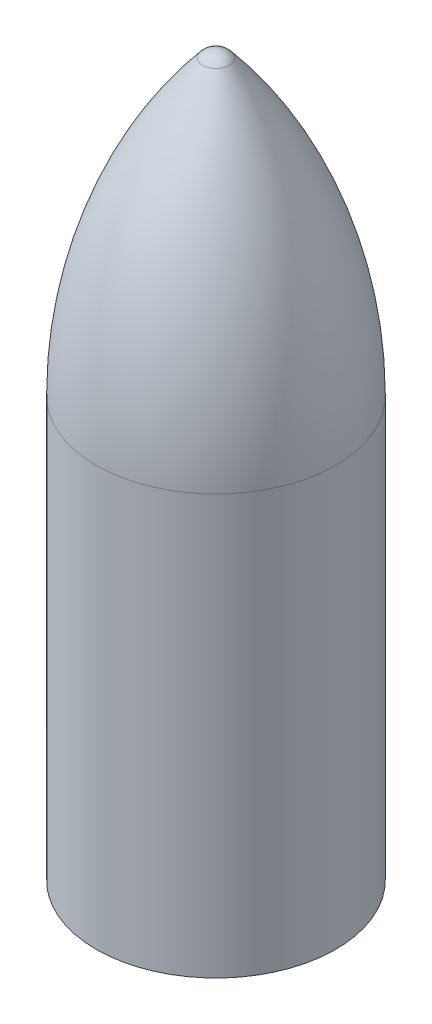
ISO-10303-21;
HEADER;
FILE_DESCRIPTION(('STEP AP214'),'2;1');
FILE_NAME('part.step','',(''),(''),'','','');
FILE_SCHEMA(('AUTOMOTIVE_DESIGN { 1 0 10303 214 1 1 1 1 }'));
ENDSEC;
DATA;
#1=APPLICATION_CONTEXT('core data for automotive mechanical design processes');
#2=APPLICATION_PROTOCOL_DEFINITION('international standard','automotive_design',2000,#1);
#3=PRODUCT_CONTEXT('',#1,'mechanical');
#4=PRODUCT('Part','Part','',(#3));
#5=PRODUCT_RELATED_PRODUCT_CATEGORY('part','',(#4));
#6=PRODUCT_DEFINITION_FORMATION('','',#4);
#7=PRODUCT_DEFINITION_CONTEXT('part definition',#1,'design');
#8=PRODUCT_DEFINITION('design','',#6,#7);
#9=PRODUCT_DEFINITION_SHAPE('','',#8);
#10=(LENGTH_UNIT() NAMED_UNIT(*) SI_UNIT(.MILLI.,.METRE.));
#11=(NAMED_UNIT(*) PLANE_ANGLE_UNIT() SI_UNIT($,.RADIAN.));
#12=(NAMED_UNIT(*) SI_UNIT($,.STERADIAN.) SOLID_ANGLE_UNIT());
#13=UNCERTAINTY_MEASURE_WITH_UNIT(LENGTH_MEASURE(1.E-05),#10,'distance_accuracy_value','');
#14=(GEOMETRIC_REPRESENTATION_CONTEXT(3) GLOBAL_UNCERTAINTY_ASSIGNED_CONTEXT((#13)) GLOBAL_UNIT_ASSIGNED_CONTEXT((#10,
#11,#12)) REPRESENTATION_CONTEXT('',''));
#15=CARTESIAN_POINT('',(0.,0.,0.));
#16=DIRECTION('',(0.,0.,1.));
#17=DIRECTION('',(1.,0.,0.));
#18=AXIS2_PLACEMENT_3D('',#15,#16,#17);
#19=CARTESIAN_POINT('',(-50.8,0.,0.));
#20=DIRECTION('',(0.,-1.,0.));
#21=DIRECTION('',(0.,0.,-1.));
#22=AXIS2_PLACEMENT_3D('',#19,#20,#21);
#23=PLANE('',#22);
#24=CARTESIAN_POINT('',(0.,0.,0.));
#25=DIRECTION('',(0.,-1.,0.));
#26=DIRECTION('',(0.,0.,-1.));
#27=AXIS2_PLACEMENT_3D('',#24,#25,#26);
#28=CIRCLE('',#27,48.26);
#29=CARTESIAN_POINT('',(0.,0.,-48.26));
#30=VERTEX_POINT('',#29);
#31=EDGE_CURVE('E54',#30,#30,#28,.F.);
#32=ORIENTED_EDGE('',*,*,#31,.T.);
#33=EDGE_LOOP('',(#32));
#34=FACE_BOUND('',#33,.T.);
#35=CARTESIAN_POINT('',(0.,0.,0.));
#36=DIRECTION('',(0.,1.,0.));
#37=DIRECTION('',(0.,0.,1.));
#38=AXIS2_PLACEMENT_3D('',#35,#36,#37);
#39=CIRCLE('',#38,50.8);
#40=CARTESIAN_POINT('',(0.,0.,50.8));
#41=VERTEX_POINT('',#40);
#42=EDGE_CURVE('E10',#41,#41,#39,.T.);
#43=ORIENTED_EDGE('',*,*,#42,.F.);
#44=EDGE_LOOP('',(#43));
#45=FACE_BOUND('',#44,.T.);
#46=ADVANCED_FACE('F37',(#34,#45),#23,.T.);
#47=CARTESIAN_POINT('',(0.,255.455794576252,0.));
#48=DIRECTION('',(0.,1.,0.));
#49=DIRECTION('',(0.,0.,1.));
#50=AXIS2_PLACEMENT_3D('',#47,#48,#49);
#51=CYLINDRICAL_SURFACE('',#50,50.8);
#52=ORIENTED_EDGE('',*,*,#42,.T.);
#53=EDGE_LOOP('',(#52));
#54=FACE_BOUND('',#53,.T.);
#55=CARTESIAN_POINT('',(0.,177.8,0.));
#56=DIRECTION('',(0.,1.,0.));
#57=DIRECTION('',(0.,0.,1.));
#58=AXIS2_PLACEMENT_3D('',#55,#56,#57);
#59=CIRCLE('',#58,50.8);
#60=CARTESIAN_POINT('',(0.,177.8,50.8));
#61=VERTEX_POINT('',#60);
#62=EDGE_CURVE('E44',#61,#61,#59,.T.);
#63=ORIENTED_EDGE('',*,*,#62,.F.);
#64=EDGE_LOOP('',(#63));
#65=FACE_BOUND('',#64,.T.);
#66=ADVANCED_FACE('F84',(#54,#65),#51,.T.);
#67=CARTESIAN_POINT('',(0.,177.8,0.));
#68=DIRECTION('',(0.,1.,0.));
#69=DIRECTION('',(0.,0.,1.));
#70=AXIS2_PLACEMENT_3D('',#67,#68,#69);
#71=DEGENERATE_TOROIDAL_SURFACE('',#70,143.078646432094,193.878646432093,.F.);
#72=ORIENTED_EDGE('',*,*,#62,.T.);
#73=EDGE_LOOP('',(#72));
#74=FACE_BOUND('',#73,.T.);
#75=CARTESIAN_POINT('',(0.,302.149894824193,0.));
#76=DIRECTION('',(0.,1.,0.));
#77=DIRECTION('',(0.,0.,1.));
#78=AXIS2_PLACEMENT_3D('',#75,#76,#77);
#79=CIRCLE('',#78,5.66957439609972);
#80=CARTESIAN_POINT('',(0.,302.149894824193,5.66957439609972));
#81=VERTEX_POINT('',#80);
#82=EDGE_CURVE('E49',#81,#81,#79,.T.);
#83=ORIENTED_EDGE('',*,*,#82,.F.);
#84=EDGE_LOOP('',(#83));
#85=FACE_BOUND('',#84,.T.);
#86=ADVANCED_FACE('F89',(#74,#85),#71,.F.);
#87=CARTESIAN_POINT('',(0.,297.410268521924,0.));
#88=DIRECTION('',(0.,1.,0.));
#89=DIRECTION('',(1.,0.,0.));
#90=AXIS2_PLACEMENT_3D('',#87,#88,#89);
#91=SPHERICAL_SURFACE('',#90,7.38973147807575);
#92=ORIENTED_EDGE('',*,*,#82,.T.);
#93=EDGE_LOOP('',(#92));
#94=FACE_BOUND('',#93,.T.);
#95=ADVANCED_FACE('F94',(#94),#91,.T.);
#96=CARTESIAN_POINT('',(0.,255.455794576252,0.));
#97=DIRECTION('',(0.,1.,0.));
#98=DIRECTION('',(0.,0.,1.));
#99=AXIS2_PLACEMENT_3D('',#96,#97,#98);
#100=CYLINDRICAL_SURFACE('',#99,48.26);
#101=ORIENTED_EDGE('',*,*,#31,.F.);
#102=EDGE_LOOP('',(#101));
#103=FACE_BOUND('',#102,.T.);
#104=CARTESIAN_POINT('',(0.,177.8,0.));
#105=DIRECTION('',(0.,1.,0.));
#106=DIRECTION('',(0.,0.,1.));
#107=AXIS2_PLACEMENT_3D('',#104,#105,#106);
#108=CIRCLE('',#107,48.26);
#109=CARTESIAN_POINT('',(0.,177.8,48.26));
#110=VERTEX_POINT('',#109);
#111=EDGE_CURVE('E60',#110,#110,#108,.T.);
#112=ORIENTED_EDGE('',*,*,#111,.T.);
#113=EDGE_LOOP('',(#112));
#114=FACE_BOUND('',#113,.T.);
#115=ADVANCED_FACE('F69',(#103,#114),#100,.F.);
#116=CARTESIAN_POINT('',(0.,177.8,0.));
#117=DIRECTION('',(0.,1.,0.));
#118=DIRECTION('',(0.,0.,1.));
#119=AXIS2_PLACEMENT_3D('',#116,#117,#118);
#120=DEGENERATE_TOROIDAL_SURFACE('',#119,143.078646432094,191.338646432093,.F.);
#121=ORIENTED_EDGE('',*,*,#111,.F.);
#122=EDGE_LOOP('',(#121));
#123=FACE_BOUND('',#122,.T.);
#124=CARTESIAN_POINT('',(0.,300.520789511844,0.));
#125=DIRECTION('',(0.,1.,0.));
#126=DIRECTION('',(0.,0.,1.));
#127=AXIS2_PLACEMENT_3D('',#124,#125,#126);
#128=CIRCLE('',#127,3.72082713663324);
#129=CARTESIAN_POINT('',(0.,300.520789511844,3.72082713663324));
#130=VERTEX_POINT('',#129);
#131=EDGE_CURVE('E61',#130,#130,#128,.T.);
#132=ORIENTED_EDGE('',*,*,#131,.T.);
#133=EDGE_LOOP('',(#132));
#134=FACE_BOUND('',#133,.T.);
#135=ADVANCED_FACE('F71',(#123,#134),#120,.T.);
#136=CARTESIAN_POINT('',(0.,297.410268521924,0.));
#137=DIRECTION('',(0.,1.,0.));
#138=DIRECTION('',(1.,0.,0.));
#139=AXIS2_PLACEMENT_3D('',#136,#137,#138);
#140=SPHERICAL_SURFACE('',#139,4.84973147807575);
#141=ORIENTED_EDGE('',*,*,#131,.F.);
#142=EDGE_LOOP('',(#141));
#143=FACE_BOUND('',#142,.T.);
#144=ADVANCED_FACE('F74',(#143),#140,.F.);
#145=CLOSED_SHELL('',(#46,#66,#86,#95,#115,#135,#144));
#146=MANIFOLD_SOLID_BREP('B2',#145);
#147=ADVANCED_BREP_SHAPE_REPRESENTATION('',(#18,#146),#14);
#148=SHAPE_DEFINITION_REPRESENTATION(#9,#147);
ENDSEC;
END-ISO-10303-21;
